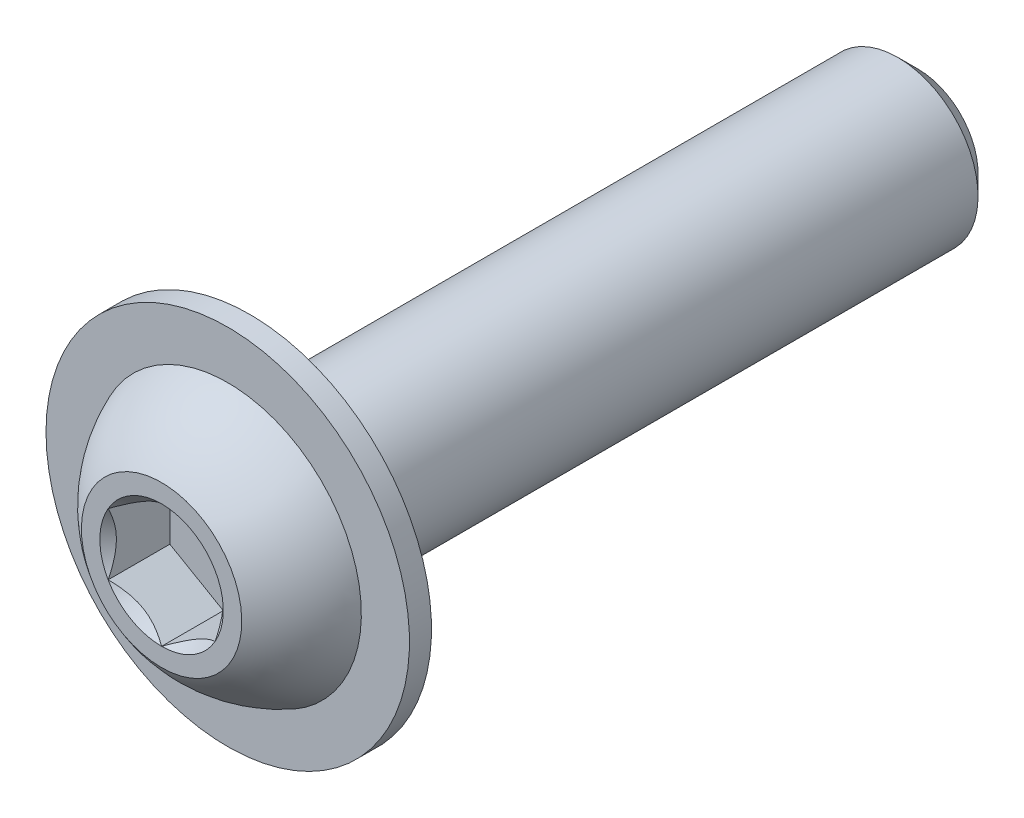
ISO-10303-21;
HEADER;
FILE_DESCRIPTION(('STEP AP214'),'2;1');
FILE_NAME('part.step','',(''),(''),'','','');
FILE_SCHEMA(('AUTOMOTIVE_DESIGN { 1 0 10303 214 1 1 1 1 }'));
ENDSEC;
DATA;
#1=APPLICATION_CONTEXT('core data for automotive mechanical design processes');
#2=APPLICATION_PROTOCOL_DEFINITION('international standard','automotive_design',2000,#1);
#3=PRODUCT_CONTEXT('',#1,'mechanical');
#4=PRODUCT('Part','Part','',(#3));
#5=PRODUCT_RELATED_PRODUCT_CATEGORY('part','',(#4));
#6=PRODUCT_DEFINITION_FORMATION('','',#4);
#7=PRODUCT_DEFINITION_CONTEXT('part definition',#1,'design');
#8=PRODUCT_DEFINITION('design','',#6,#7);
#9=PRODUCT_DEFINITION_SHAPE('','',#8);
#10=(LENGTH_UNIT() NAMED_UNIT(*) SI_UNIT(.MILLI.,.METRE.));
#11=(NAMED_UNIT(*) PLANE_ANGLE_UNIT() SI_UNIT($,.RADIAN.));
#12=(NAMED_UNIT(*) SI_UNIT($,.STERADIAN.) SOLID_ANGLE_UNIT());
#13=UNCERTAINTY_MEASURE_WITH_UNIT(LENGTH_MEASURE(1.E-05),#10,'distance_accuracy_value','');
#14=(GEOMETRIC_REPRESENTATION_CONTEXT(3) GLOBAL_UNCERTAINTY_ASSIGNED_CONTEXT((#13)) GLOBAL_UNIT_ASSIGNED_CONTEXT((#10,
#11,#12)) REPRESENTATION_CONTEXT('',''));
#15=CARTESIAN_POINT('',(0.,0.,0.));
#16=DIRECTION('',(0.,0.,1.));
#17=DIRECTION('',(1.,0.,0.));
#18=AXIS2_PLACEMENT_3D('',#15,#16,#17);
#19=CARTESIAN_POINT('',(0.,-3.,-28.3));
#20=DIRECTION('',(0.,0.,-1.));
#21=DIRECTION('',(0.,1.,0.));
#22=AXIS2_PLACEMENT_3D('',#19,#20,#21);
#23=PLANE('',#22);
#24=CARTESIAN_POINT('',(0.,0.,-28.3));
#25=DIRECTION('',(0.,0.,-1.));
#26=DIRECTION('',(0.,1.,0.));
#27=AXIS2_PLACEMENT_3D('',#24,#25,#26);
#28=CIRCLE('',#27,2.25);
#29=CARTESIAN_POINT('',(0.,2.25,-28.3));
#30=VERTEX_POINT('',#29);
#31=EDGE_CURVE('E203',#30,#30,#28,.T.);
#32=ORIENTED_EDGE('',*,*,#31,.T.);
#33=EDGE_LOOP('',(#32));
#34=FACE_BOUND('',#33,.T.);
#35=ADVANCED_FACE('F41',(#34),#23,.T.);
#36=CARTESIAN_POINT('',(0.,0.,-28.3));
#37=DIRECTION('',(0.,0.,-1.));
#38=DIRECTION('',(0.,1.,0.));
#39=AXIS2_PLACEMENT_3D('',#36,#37,#38);
#40=CYLINDRICAL_SURFACE('',#39,3.);
#41=CARTESIAN_POINT('',(0.,0.,-27.55));
#42=DIRECTION('',(0.,0.,-1.));
#43=DIRECTION('',(0.,1.,0.));
#44=AXIS2_PLACEMENT_3D('',#41,#42,#43);
#45=CIRCLE('',#44,3.);
#46=CARTESIAN_POINT('',(0.,3.,-27.55));
#47=VERTEX_POINT('',#46);
#48=EDGE_CURVE('E56',#47,#47,#45,.F.);
#49=ORIENTED_EDGE('',*,*,#48,.T.);
#50=EDGE_LOOP('',(#49));
#51=FACE_BOUND('',#50,.T.);
#52=CARTESIAN_POINT('',(0.,0.,-3.3));
#53=DIRECTION('',(0.,0.,1.));
#54=DIRECTION('',(1.,0.,0.));
#55=AXIS2_PLACEMENT_3D('',#52,#53,#54);
#56=CIRCLE('',#55,3.);
#57=CARTESIAN_POINT('',(3.,0.,-3.3));
#58=VERTEX_POINT('',#57);
#59=EDGE_CURVE('E199',#58,#58,#56,.F.);
#60=ORIENTED_EDGE('',*,*,#59,.T.);
#61=EDGE_LOOP('',(#60));
#62=FACE_BOUND('',#61,.T.);
#63=ADVANCED_FACE('F210',(#51,#62),#40,.T.);
#64=CARTESIAN_POINT('',(0.,0.,-28.3));
#65=DIRECTION('',(0.,0.,1.));
#66=DIRECTION('',(0.,-1.,0.));
#67=AXIS2_PLACEMENT_3D('',#64,#65,#66);
#68=CONICAL_SURFACE('',#67,2.25,0.785398163397447);
#69=ORIENTED_EDGE('',*,*,#48,.F.);
#70=EDGE_LOOP('',(#69));
#71=FACE_BOUND('',#70,.T.);
#72=ORIENTED_EDGE('',*,*,#31,.F.);
#73=EDGE_LOOP('',(#72));
#74=FACE_BOUND('',#73,.T.);
#75=ADVANCED_FACE('F43',(#71,#74),#68,.T.);
#76=CARTESIAN_POINT('',(0.,-5.,-3.3));
#77=DIRECTION('',(0.,0.,1.));
#78=DIRECTION('',(1.,0.,0.));
#79=AXIS2_PLACEMENT_3D('',#76,#77,#78);
#80=PLANE('',#79);
#81=ORIENTED_EDGE('',*,*,#59,.F.);
#82=EDGE_LOOP('',(#81));
#83=FACE_BOUND('',#82,.T.);
#84=CARTESIAN_POINT('',(0.,0.,-3.3));
#85=DIRECTION('',(0.,0.,-1.));
#86=DIRECTION('',(-1.,0.,0.));
#87=AXIS2_PLACEMENT_3D('',#84,#85,#86);
#88=CIRCLE('',#87,6.8);
#89=CARTESIAN_POINT('',(-6.8,0.,-3.3));
#90=VERTEX_POINT('',#89);
#91=EDGE_CURVE('E188',#90,#90,#88,.T.);
#92=ORIENTED_EDGE('',*,*,#91,.T.);
#93=EDGE_LOOP('',(#92));
#94=FACE_BOUND('',#93,.T.);
#95=ADVANCED_FACE('F215',(#83,#94),#80,.F.);
#96=CARTESIAN_POINT('',(0.,0.,-2.475));
#97=DIRECTION('',(0.,0.,-1.));
#98=DIRECTION('',(-1.,0.,0.));
#99=AXIS2_PLACEMENT_3D('',#96,#97,#98);
#100=PLANE('',#99);
#101=CARTESIAN_POINT('',(0.,0.,-2.475));
#102=DIRECTION('',(0.,0.,-1.));
#103=DIRECTION('',(-1.,0.,0.));
#104=AXIS2_PLACEMENT_3D('',#101,#102,#103);
#105=CIRCLE('',#104,6.8);
#106=CARTESIAN_POINT('',(-6.8,0.,-2.475));
#107=VERTEX_POINT('',#106);
#108=EDGE_CURVE('E183',#107,#107,#105,.T.);
#109=ORIENTED_EDGE('',*,*,#108,.F.);
#110=EDGE_LOOP('',(#109));
#111=FACE_BOUND('',#110,.T.);
#112=CARTESIAN_POINT('',(0.,0.,-2.475));
#113=DIRECTION('',(0.,0.,-1.));
#114=DIRECTION('',(-1.,0.,0.));
#115=AXIS2_PLACEMENT_3D('',#112,#113,#114);
#116=CIRCLE('',#115,5.);
#117=CARTESIAN_POINT('',(0.,-5.,-2.475));
#118=VERTEX_POINT('',#117);
#119=EDGE_CURVE('E187',#118,#118,#116,.T.);
#120=ORIENTED_EDGE('',*,*,#119,.T.);
#121=EDGE_LOOP('',(#120));
#122=FACE_BOUND('',#121,.T.);
#123=ADVANCED_FACE('F233',(#111,#122),#100,.F.);
#124=CARTESIAN_POINT('',(0.,0.,-2.475));
#125=DIRECTION('',(0.,0.,-1.));
#126=DIRECTION('',(-1.,0.,0.));
#127=AXIS2_PLACEMENT_3D('',#124,#125,#126);
#128=CYLINDRICAL_SURFACE('',#127,6.8);
#129=ORIENTED_EDGE('',*,*,#108,.T.);
#130=EDGE_LOOP('',(#129));
#131=FACE_BOUND('',#130,.T.);
#132=ORIENTED_EDGE('',*,*,#91,.F.);
#133=EDGE_LOOP('',(#132));
#134=FACE_BOUND('',#133,.T.);
#135=ADVANCED_FACE('F230',(#131,#134),#128,.T.);
#136=CARTESIAN_POINT('',(0.,-3.,0.));
#137=DIRECTION('',(0.,0.,-1.));
#138=DIRECTION('',(-1.,0.,0.));
#139=AXIS2_PLACEMENT_3D('',#136,#137,#138);
#140=PLANE('',#139);
#141=CARTESIAN_POINT('',(0.,0.,0.));
#142=DIRECTION('',(0.,0.,1.));
#143=DIRECTION('',(1.,0.,0.));
#144=AXIS2_PLACEMENT_3D('',#141,#142,#143);
#145=CIRCLE('',#144,2.3094010767585);
#146=CARTESIAN_POINT('',(-2.,1.15470053837925,0.));
#147=VERTEX_POINT('',#146);
#148=CARTESIAN_POINT('',(-2.,-1.15470053837925,0.));
#149=VERTEX_POINT('',#148);
#150=EDGE_CURVE('E69',#147,#149,#145,.T.);
#151=ORIENTED_EDGE('',*,*,#150,.F.);
#152=CARTESIAN_POINT('',(0.,2.3094010767585,0.));
#153=VERTEX_POINT('',#152);
#154=EDGE_CURVE('E146',#153,#147,#145,.T.);
#155=ORIENTED_EDGE('',*,*,#154,.F.);
#156=CARTESIAN_POINT('',(2.,1.15470053837925,0.));
#157=VERTEX_POINT('',#156);
#158=EDGE_CURVE('E141',#157,#153,#145,.T.);
#159=ORIENTED_EDGE('',*,*,#158,.F.);
#160=CARTESIAN_POINT('',(2.,-1.15470053837925,0.));
#161=VERTEX_POINT('',#160);
#162=EDGE_CURVE('E110',#161,#157,#145,.T.);
#163=ORIENTED_EDGE('',*,*,#162,.F.);
#164=CARTESIAN_POINT('',(0.,-2.3094010767585,0.));
#165=VERTEX_POINT('',#164);
#166=EDGE_CURVE('E101',#165,#161,#145,.T.);
#167=ORIENTED_EDGE('',*,*,#166,.F.);
#168=EDGE_CURVE('E62',#149,#165,#145,.T.);
#169=ORIENTED_EDGE('',*,*,#168,.F.);
#170=EDGE_LOOP('',(#151,#155,#159,#163,#167,#169));
#171=FACE_BOUND('',#170,.T.);
#172=CARTESIAN_POINT('',(0.,0.,0.));
#173=DIRECTION('',(0.,0.,1.));
#174=DIRECTION('',(1.,0.,0.));
#175=AXIS2_PLACEMENT_3D('',#172,#173,#174);
#176=CIRCLE('',#175,3.);
#177=CARTESIAN_POINT('',(0.,-3.,0.));
#178=VERTEX_POINT('',#177);
#179=EDGE_CURVE('E195',#178,#178,#176,.T.);
#180=ORIENTED_EDGE('',*,*,#179,.T.);
#181=EDGE_LOOP('',(#180));
#182=FACE_BOUND('',#181,.T.);
#183=ADVANCED_FACE('F138',(#171,#182),#140,.F.);
#184=CARTESIAN_POINT('',(0.,0.,-4.46982323232323));
#185=DIRECTION('',(0.,0.,1.));
#186=DIRECTION('',(0.,-1.,0.));
#187=AXIS2_PLACEMENT_3D('',#184,#185,#186);
#188=SPHERICAL_SURFACE('',#187,5.38324434966652);
#189=CARTESIAN_POINT('',(0.,-3.,0.));
#190=CARTESIAN_POINT('',(0.,-3.02793971131669,-0.0187521776932429));
#191=CARTESIAN_POINT('',(0.,-3.05570355525953,-0.0377663850890329));
#192=CARTESIAN_POINT('',(0.,-3.11086984588058,-0.0763120297819729));
#193=CARTESIAN_POINT('',(0.,-3.13827229255879,-0.095843467079123));
#194=CARTESIAN_POINT('',(0.,-3.19270612613364,-0.135416742071047));
#195=CARTESIAN_POINT('',(0.,-3.21973751303028,-0.15545857976582));
#196=CARTESIAN_POINT('',(0.,-3.27341972905368,-0.19604559784099));
#197=CARTESIAN_POINT('',(0.,-3.30007055818043,-0.216590778221387));
#198=CARTESIAN_POINT('',(0.,-3.35298228536925,-0.258177260020972));
#199=CARTESIAN_POINT('',(0.,-3.37924318343132,-0.279218561440162));
#200=CARTESIAN_POINT('',(0.,-3.43136581475418,-0.321789885718026));
#201=CARTESIAN_POINT('',(0.,-3.45722754801497,-0.343319908576701));
#202=CARTESIAN_POINT('',(0.,-3.50854275570397,-0.386861105220153));
#203=CARTESIAN_POINT('',(0.,-3.53399623013217,-0.408872279004929));
#204=CARTESIAN_POINT('',(0.,-3.58448596985833,-0.453368037546438));
#205=CARTESIAN_POINT('',(0.,-3.60952223515628,-0.475852622303171));
#206=CARTESIAN_POINT('',(0.,-3.65916875298262,-0.521287296433854));
#207=CARTESIAN_POINT('',(0.,-3.68377900551101,-0.544237385807804));
#208=CARTESIAN_POINT('',(0.,-3.73256484397254,-0.590594999112384));
#209=CARTESIAN_POINT('',(0.,-3.75674042990568,-0.614002523043015));
#210=CARTESIAN_POINT('',(0.,-3.80464843419169,-0.661266774555216));
#211=CARTESIAN_POINT('',(0.,-3.82838085254456,-0.685123502136785));
#212=CARTESIAN_POINT('',(0.,-3.87539417651916,-0.733277772088057));
#213=CARTESIAN_POINT('',(0.,-3.8986750821409,-0.757575314457759));
#214=CARTESIAN_POINT('',(0.,-3.94477719426987,-0.806602670116894));
#215=CARTESIAN_POINT('',(0.,-3.9675984007771,-0.831332483406326));
#216=CARTESIAN_POINT('',(0.,-4.0127730899401,-0.881215685034799));
#217=CARTESIAN_POINT('',(0.,-4.03512657259586,-0.90636907337384));
#218=CARTESIAN_POINT('',(0.,-4.07935795378703,-0.957090580287584));
#219=CARTESIAN_POINT('',(0.,-4.10123585232245,-0.982658698862288));
#220=CARTESIAN_POINT('',(0.,-4.14450837223613,-1.0342006755997));
#221=CARTESIAN_POINT('',(0.,-4.1659029936144,-1.06017453376241));
#222=CARTESIAN_POINT('',(0.,-4.20820143611419,-1.1125188563559));
#223=CARTESIAN_POINT('',(0.,-4.22910525723572,-1.13888932078669));
#224=CARTESIAN_POINT('',(0.,-4.27041474870502,-1.19201758313572));
#225=CARTESIAN_POINT('',(0.,-4.2908204190528,-1.21877538105397));
#226=CARTESIAN_POINT('',(0.,-4.33112643362489,-1.27266890139727));
#227=CARTESIAN_POINT('',(0.,-4.35102677784921,-1.29980462382233));
#228=CARTESIAN_POINT('',(0.,-4.39031514251508,-1.35444445130707));
#229=CARTESIAN_POINT('',(0.,-4.40970316295662,-1.38194855636675));
#230=CARTESIAN_POINT('',(0.,-4.44796006254863,-1.43731547771232));
#231=CARTESIAN_POINT('',(0.,-4.46682894169908,-1.46517829399821));
#232=CARTESIAN_POINT('',(0.,-4.50404092374899,-1.52125284025227));
#233=CARTESIAN_POINT('',(0.,-4.52238402664844,-1.54946457022044));
#234=CARTESIAN_POINT('',(0.,-4.55853800611739,-1.60622702360501));
#235=CARTESIAN_POINT('',(0.,-4.5763488826869,-1.6347777470214));
#236=CARTESIAN_POINT('',(0.,-4.61143214656795,-1.69220814786576));
#237=CARTESIAN_POINT('',(0.,-4.62870453387949,-1.72108782529373));
#238=CARTESIAN_POINT('',(0.,-4.66270474566288,-1.77916597905509));
#239=CARTESIAN_POINT('',(0.,-4.67943257013472,-1.80836445538848));
#240=CARTESIAN_POINT('',(0.,-4.71233777416465,-1.86706993974512));
#241=CARTESIAN_POINT('',(0.,-4.72851515372273,-1.89657694776838));
#242=CARTESIAN_POINT('',(0.,-4.76031377933115,-1.95588911983047));
#243=CARTESIAN_POINT('',(0.,-4.77593502538148,-1.98569428386932));
#244=CARTESIAN_POINT('',(0.,-4.80661589121892,-2.04559228732732));
#245=CARTESIAN_POINT('',(0.,-4.82167551100602,-2.07568512674649));
#246=CARTESIAN_POINT('',(0.,-4.85122782799487,-2.13614789961676));
#247=CARTESIAN_POINT('',(0.,-4.86572052519661,-2.16651783306787));
#248=CARTESIAN_POINT('',(0.,-4.89413390397663,-2.22752411356193));
#249=CARTESIAN_POINT('',(0.,-4.90805458555491,-2.25816046060487));
#250=CARTESIAN_POINT('',(0.,-4.93531902650819,-2.31968880034151));
#251=CARTESIAN_POINT('',(0.,-4.94866278588318,-2.35058079303519));
#252=CARTESIAN_POINT('',(0.,-4.97476873351197,-2.41260954317643));
#253=CARTESIAN_POINT('',(0.,-4.98753092176576,-2.44374630062397));
#254=CARTESIAN_POINT('',(0.,-5.,-2.475));
#255=B_SPLINE_CURVE_WITH_KNOTS('',3,(#189,#190,#191,#192,#193,#194,#195,#196,#197,#198,#199,
#200,#201,#202,#203,#204,#205,#206,#207,#208,#209,#210,#211,#212,#213,#214,#215,#216,#217,#218,
#219,#220,#221,#222,#223,#224,#225,#226,#227,#228,#229,#230,#231,#232,#233,#234,#235,#236,#237,
#238,#239,#240,#241,#242,#243,#244,#245,#246,#247,#248,#249,#250,#251,#252,#253,#254),
.UNSPECIFIED.,.F.,.F.,(4,2,2,2,2,2,2,2,2,2,2,2,2,2,2,2,2,2,2,2,2,2,2,2,2,2,2,2,2,2,2,2,4),(0.,
0.100946251424784,0.201892502849569,0.302838754274352,0.403785005699137,0.50473125712392,
0.605677508548705,0.706623759973489,0.807570011398273,0.908516262823057,1.00946251424784,
1.11040876567263,1.21135501709741,1.31230126852219,1.41324751994698,1.51419377137176,
1.61514002279655,1.71608627422133,1.81703252564611,1.9179787770709,2.01892502849568,
2.11987127992047,2.22081753134525,2.32176378277003,2.42271003419482,2.5236562856196,
2.62460253704439,2.72554878846917,2.82649503989396,2.92744129131874,3.02838754274352,
3.12933379416831,3.23028004559309),.UNSPECIFIED.);
#256=EDGE_CURVE('BSEAM224',#178,#118,#255,.T.);
#257=ORIENTED_EDGE('',*,*,#179,.F.);
#258=ORIENTED_EDGE('',*,*,#119,.F.);
#259=ORIENTED_EDGE('',*,*,#256,.T.);
#260=ORIENTED_EDGE('',*,*,#256,.F.);
#261=EDGE_LOOP('',(#257,#259,#258,#260));
#262=FACE_BOUND('',#261,.T.);
#263=ADVANCED_FACE('F224',(#262),#188,.T.);
#264=CARTESIAN_POINT('',(0.,0.,0.));
#265=DIRECTION('',(0.,0.,1.));
#266=DIRECTION('',(1.,0.,0.));
#267=AXIS2_PLACEMENT_3D('',#264,#265,#266);
#268=CONICAL_SURFACE('',#267,2.3094010767585,0.78539816339745);
#269=ORIENTED_EDGE('',*,*,#162,.T.);
#270=CARTESIAN_POINT('',(2.,-2.30294417292923,0.740771355027721));
#271=CARTESIAN_POINT('',(2.,-2.24687002663712,0.698443273625964));
#272=CARTESIAN_POINT('',(2.,-2.19048190536959,0.656525156864338));
#273=CARTESIAN_POINT('',(2.,-2.07695390496424,0.573690417861017));
#274=CARTESIAN_POINT('',(2.,-2.01981384066454,0.532774049668074));
#275=CARTESIAN_POINT('',(2.,-1.90424016804776,0.451833452018563));
#276=CARTESIAN_POINT('',(2.,-1.8457999674391,0.411818591559868));
#277=CARTESIAN_POINT('',(2.,-1.7279274546176,0.333288993664294));
#278=CARTESIAN_POINT('',(2.,-1.66849521292324,0.294774150243142));
#279=CARTESIAN_POINT('',(2.,-1.4816299571002,0.177640651604295));
#280=CARTESIAN_POINT('',(2.,-1.35220318163536,0.102145901729644));
#281=CARTESIAN_POINT('',(2.,-1.08689521592924,-0.035950649005619));
#282=CARTESIAN_POINT('',(2.,-0.951037763938191,-0.0985959140965044));
#283=CARTESIAN_POINT('',(2.,-0.747111912259408,-0.175236456124857));
#284=CARTESIAN_POINT('',(2.,-0.682064034147875,-0.197232820080877));
#285=CARTESIAN_POINT('',(2.,-0.550398103294751,-0.23600331233986));
#286=CARTESIAN_POINT('',(2.,-0.483779942722474,-0.252777080878817));
#287=CARTESIAN_POINT('',(2.,-0.350484328847653,-0.279951742115555));
#288=CARTESIAN_POINT('',(2.,-0.283829489364785,-0.290461823258314));
#289=CARTESIAN_POINT('',(2.,-0.149806987139376,-0.304903914455084));
#290=CARTESIAN_POINT('',(2.,-0.0824394489341211,-0.308837055266886));
#291=CARTESIAN_POINT('',(2.,0.0499055622944906,-0.309833523066283));
#292=CARTESIAN_POINT('',(2.,0.114881285143173,-0.307140355149591));
#293=CARTESIAN_POINT('',(2.,0.244275921482762,-0.295569929577308));
#294=CARTESIAN_POINT('',(2.,0.308694780266754,-0.286692071166776));
#295=CARTESIAN_POINT('',(2.,0.437599788610706,-0.263086340703852));
#296=CARTESIAN_POINT('',(2.,0.502067428644596,-0.248258916553488));
#297=CARTESIAN_POINT('',(2.,0.629594322598307,-0.21354211637203));
#298=CARTESIAN_POINT('',(2.,0.692653693883151,-0.193653163893724));
#299=CARTESIAN_POINT('',(2.,0.891187889210545,-0.123553020743801));
#300=CARTESIAN_POINT('',(2.,1.02383545707306,-0.065358199678491));
#301=CARTESIAN_POINT('',(2.,1.28290932150074,0.0640305754595763));
#302=CARTESIAN_POINT('',(2.,1.4093111258757,0.135271231414841));
#303=CARTESIAN_POINT('',(2.,1.59200441438963,0.24644199187472));
#304=CARTESIAN_POINT('',(2.,1.65027549026191,0.283182190337375));
#305=CARTESIAN_POINT('',(2.,1.76581760389243,0.358214514183766));
#306=CARTESIAN_POINT('',(2.,1.82308856543105,0.396506757118039));
#307=CARTESIAN_POINT('',(2.,1.93629654762084,0.474042264081225));
#308=CARTESIAN_POINT('',(2.,1.99224062500539,0.513275276133585));
#309=CARTESIAN_POINT('',(2.,2.103364240299,0.592778830736516));
#310=CARTESIAN_POINT('',(2.,2.15854398422468,0.633049085000597));
#311=CARTESIAN_POINT('',(2.,2.21340370692659,0.673744238145942));
#312=B_SPLINE_CURVE_WITH_KNOTS('',3,(#270,#271,#272,#273,#274,#275,#276,#277,#278,#279,#280,
#281,#282,#283,#284,#285,#286,#287,#288,#289,#290,#291,#292,#293,#294,#295,#296,#297,#298,#299,
#300,#301,#302,#303,#304,#305,#306,#307,#308,#309,#310,#311),.UNSPECIFIED.,.F.,.F.,(4,2,2,2,2,2,
2,2,2,2,2,2,2,2,2,2,2,2,2,2,4),(0.,0.210772731976891,0.421598374658589,0.634057554623488,
0.84650169587017,1.29562155455624,1.74319622821645,1.94902062110207,2.15485918928326,
2.35699582502635,2.5590977043214,2.75388435553556,2.94868993014815,3.14690093452586,
3.34509535789702,3.77838155837654,4.21325029921625,4.41989056685647,4.62654651460921,
4.8315237711129,5.03644465914085),.UNSPECIFIED.);
#313=EDGE_CURVE('E11',#161,#157,#312,.T.);
#314=ORIENTED_EDGE('',*,*,#313,.F.);
#315=EDGE_LOOP('',(#269,#314));
#316=FACE_BOUND('',#315,.T.);
#317=ADVANCED_FACE('F114',(#316),#268,.F.);
#318=ORIENTED_EDGE('',*,*,#158,.T.);
#319=CARTESIAN_POINT('',(2.0002,1.15458506832541,0.000115478713659206));
#320=CARTESIAN_POINT('',(1.93144696596929,1.19427965103065,-0.0395469097744083));
#321=CARTESIAN_POINT('',(1.86154425786449,1.23463799837204,-0.0768800177158386));
#322=CARTESIAN_POINT('',(1.71900475544956,1.31693321846145,-0.145236314863858));
#323=CARTESIAN_POINT('',(1.64635440243464,1.35887791933134,-0.17622146626278));
#324=CARTESIAN_POINT('',(1.49985839894603,1.44345742638069,-0.229299783455858));
#325=CARTESIAN_POINT('',(1.4260500647537,1.48607068799507,-0.25152637282339));
#326=CARTESIAN_POINT('',(1.27680836816473,1.57223542169503,-0.28577118332492));
#327=CARTESIAN_POINT('',(1.20137956608185,1.61578426088223,-0.297814970855866));
#328=CARTESIAN_POINT('',(1.07138449932892,1.69083694766536,-0.308681488094429));
#329=CARTESIAN_POINT('',(1.01698621602989,1.72224381117151,-0.31029024639003));
#330=CARTESIAN_POINT('',(0.908278544480305,1.78500621460364,-0.307581122401289));
#331=CARTESIAN_POINT('',(0.853969194078659,1.81636173267754,-0.303261162242027));
#332=CARTESIAN_POINT('',(0.74586327241066,1.87877671565355,-0.288940432590095));
#333=CARTESIAN_POINT('',(0.692067343445206,1.90983580972306,-0.278933307237994));
#334=CARTESIAN_POINT('',(0.585405737694425,1.97141691651548,-0.253787569750341));
#335=CARTESIAN_POINT('',(0.532539989929286,2.00193897021859,-0.23864935095776));
#336=CARTESIAN_POINT('',(0.397120266910154,2.08012358375727,-0.19370549657081));
#337=CARTESIAN_POINT('',(0.31540616515052,2.12730124240478,-0.160511160574184));
#338=CARTESIAN_POINT('',(0.195252962742197,2.19667172615922,-0.104474176828631));
#339=CARTESIAN_POINT('',(0.155657147890822,2.21953238052245,-0.0847852970530607));
#340=CARTESIAN_POINT('',(0.077199041112127,2.26483018959124,-0.0436126816351295));
#341=CARTESIAN_POINT('',(0.038336316406259,2.28726759416161,-0.0221300483487539));
#342=CARTESIAN_POINT('',(-0.000200000000000462,2.30951654681234,0.000115478713658745));
#343=B_SPLINE_CURVE_WITH_KNOTS('',3,(#319,#320,#321,#322,#323,#324,#325,#326,#327,#328,#329,
#330,#331,#332,#333,#334,#335,#336,#337,#338,#339,#340,#341,#342),.UNSPECIFIED.,.F.,.F.,(4,2,2,
2,2,2,2,2,2,2,2,4),(0.,0.266420613771064,0.534393751523389,0.798110374376915,1.06116288956937,
1.24939906803722,1.43770123566248,1.62621426093932,1.81471283831913,2.11415604834145,
2.26347170717791,2.41269626969771),.UNSPECIFIED.);
#344=EDGE_CURVE('E145',#157,#153,#343,.T.);
#345=ORIENTED_EDGE('',*,*,#344,.F.);
#346=EDGE_LOOP('',(#318,#345));
#347=FACE_BOUND('',#346,.T.);
#348=ADVANCED_FACE('F330',(#347),#268,.F.);
#349=ORIENTED_EDGE('',*,*,#154,.T.);
#350=CARTESIAN_POINT('',(0.000199999999999361,2.30951654681234,0.000115478713659074));
#351=CARTESIAN_POINT('',(-0.068553034030706,2.26982196410711,-0.0395469097744086));
#352=CARTESIAN_POINT('',(-0.138455742135512,2.22946361676572,-0.0768800177158388));
#353=CARTESIAN_POINT('',(-0.280995244550437,2.1471683966763,-0.145236314863857));
#354=CARTESIAN_POINT('',(-0.353645597565359,2.10522369580642,-0.17622146626278));
#355=CARTESIAN_POINT('',(-0.500141601053972,2.02064418875706,-0.229299783455858));
#356=CARTESIAN_POINT('',(-0.573949935246295,1.97803092714269,-0.25152637282339));
#357=CARTESIAN_POINT('',(-0.723191631835265,1.89186619344273,-0.28577118332492));
#358=CARTESIAN_POINT('',(-0.798620433918153,1.84831735425552,-0.297814970855866));
#359=CARTESIAN_POINT('',(-0.928615500671081,1.7732646674724,-0.308681488094429));
#360=CARTESIAN_POINT('',(-0.98301378397011,1.74185780396625,-0.31029024639003));
#361=CARTESIAN_POINT('',(-1.09172145551969,1.67909540053412,-0.307581122401289));
#362=CARTESIAN_POINT('',(-1.14603080592134,1.64773988246021,-0.303261162242026));
#363=CARTESIAN_POINT('',(-1.25413672758934,1.5853248994842,-0.288940432590095));
#364=CARTESIAN_POINT('',(-1.30793265655479,1.55426580541469,-0.278933307237994));
#365=CARTESIAN_POINT('',(-1.41459426230558,1.49268469862228,-0.253787569750341));
#366=CARTESIAN_POINT('',(-1.46746001007071,1.46216264491916,-0.238649350957761));
#367=CARTESIAN_POINT('',(-1.60287973308985,1.38397803138048,-0.19370549657081));
#368=CARTESIAN_POINT('',(-1.68459383484948,1.33680037273297,-0.160511160574184));
#369=CARTESIAN_POINT('',(-1.8047470372578,1.26742988897853,-0.10447417682863));
#370=CARTESIAN_POINT('',(-1.84434285210918,1.24456923461531,-0.0847852970530602));
#371=CARTESIAN_POINT('',(-1.92280095888787,1.19927142554652,-0.043612681635129));
#372=CARTESIAN_POINT('',(-1.96166368359374,1.17683402097614,-0.0221300483487535));
#373=CARTESIAN_POINT('',(-2.0002,1.15458506832541,0.000115478713659183));
#374=B_SPLINE_CURVE_WITH_KNOTS('',3,(#350,#351,#352,#353,#354,#355,#356,#357,#358,#359,#360,
#361,#362,#363,#364,#365,#366,#367,#368,#369,#370,#371,#372,#373),.UNSPECIFIED.,.F.,.F.,(4,2,2,
2,2,2,2,2,2,2,2,4),(0.,0.266420613771064,0.534393751523389,0.798110374376915,1.06116288956936,
1.24939906803722,1.43770123566248,1.62621426093932,1.81471283831913,2.11415604834145,
2.26347170717791,2.41269626969771),.UNSPECIFIED.);
#375=EDGE_CURVE('E152',#153,#147,#374,.T.);
#376=ORIENTED_EDGE('',*,*,#375,.F.);
#377=EDGE_LOOP('',(#349,#376));
#378=FACE_BOUND('',#377,.T.);
#379=ADVANCED_FACE('F157',(#378),#268,.F.);
#380=ORIENTED_EDGE('',*,*,#150,.T.);
#381=CARTESIAN_POINT('',(-2.,-2.30294417292923,0.740771355027722));
#382=CARTESIAN_POINT('',(-2.,-2.24687002663712,0.698443273625965));
#383=CARTESIAN_POINT('',(-2.,-2.19048190536959,0.656525156864339));
#384=CARTESIAN_POINT('',(-2.,-2.07695390496424,0.573690417861019));
#385=CARTESIAN_POINT('',(-2.,-2.01981384066454,0.532774049668075));
#386=CARTESIAN_POINT('',(-2.,-1.90424016804776,0.451833452018564));
#387=CARTESIAN_POINT('',(-2.,-1.8457999674391,0.411818591559869));
#388=CARTESIAN_POINT('',(-2.,-1.7279274546176,0.333288993664294));
#389=CARTESIAN_POINT('',(-2.,-1.66849521292324,0.294774150243143));
#390=CARTESIAN_POINT('',(-2.,-1.4816299571002,0.177640651604295));
#391=CARTESIAN_POINT('',(-2.,-1.35220318163536,0.102145901729644));
#392=CARTESIAN_POINT('',(-2.,-1.08689521592925,-0.0359506490056186));
#393=CARTESIAN_POINT('',(-2.,-0.951037763938192,-0.0985959140965041));
#394=CARTESIAN_POINT('',(-2.,-0.747111912259409,-0.175236456124857));
#395=CARTESIAN_POINT('',(-2.,-0.682064034147876,-0.197232820080877));
#396=CARTESIAN_POINT('',(-2.,-0.550398103294752,-0.23600331233986));
#397=CARTESIAN_POINT('',(-2.,-0.483779942722475,-0.252777080878817));
#398=CARTESIAN_POINT('',(-2.,-0.350484328847654,-0.279951742115555));
#399=CARTESIAN_POINT('',(-2.,-0.283829489364785,-0.290461823258314));
#400=CARTESIAN_POINT('',(-2.,-0.149806987139376,-0.304903914455084));
#401=CARTESIAN_POINT('',(-2.,-0.0824394489341216,-0.308837055266886));
#402=CARTESIAN_POINT('',(-2.,0.0499055622944898,-0.309833523066282));
#403=CARTESIAN_POINT('',(-2.,0.114881285143172,-0.307140355149591));
#404=CARTESIAN_POINT('',(-2.,0.244275921482761,-0.295569929577307));
#405=CARTESIAN_POINT('',(-2.,0.308694780266753,-0.286692071166776));
#406=CARTESIAN_POINT('',(-2.,0.437599788610705,-0.263086340703851));
#407=CARTESIAN_POINT('',(-2.,0.502067428644595,-0.248258916553488));
#408=CARTESIAN_POINT('',(-2.,0.629594322598306,-0.21354211637203));
#409=CARTESIAN_POINT('',(-2.,0.69265369388315,-0.193653163893724));
#410=CARTESIAN_POINT('',(-2.,0.891187889210544,-0.123553020743801));
#411=CARTESIAN_POINT('',(-2.,1.02383545707306,-0.0653581996784918));
#412=CARTESIAN_POINT('',(-2.,1.28290932150074,0.0640305754595755));
#413=CARTESIAN_POINT('',(-2.,1.4093111258757,0.13527123141484));
#414=CARTESIAN_POINT('',(-2.,1.59200441438963,0.246441991874719));
#415=CARTESIAN_POINT('',(-2.,1.65027549026191,0.283182190337373));
#416=CARTESIAN_POINT('',(-2.,1.76581760389242,0.358214514183764));
#417=CARTESIAN_POINT('',(-2.,1.82308856543104,0.396506757118038));
#418=CARTESIAN_POINT('',(-2.,1.93629654762084,0.474042264081224));
#419=CARTESIAN_POINT('',(-2.,1.99224062500538,0.513275276133583));
#420=CARTESIAN_POINT('',(-2.,2.10336424029899,0.592778830736514));
#421=CARTESIAN_POINT('',(-2.,2.15854398422468,0.633049085000595));
#422=CARTESIAN_POINT('',(-2.,2.21340370692658,0.67374423814594));
#423=B_SPLINE_CURVE_WITH_KNOTS('',3,(#381,#382,#383,#384,#385,#386,#387,#388,#389,#390,#391,
#392,#393,#394,#395,#396,#397,#398,#399,#400,#401,#402,#403,#404,#405,#406,#407,#408,#409,#410,
#411,#412,#413,#414,#415,#416,#417,#418,#419,#420,#421,#422),.UNSPECIFIED.,.F.,.F.,(4,2,2,2,2,2,
2,2,2,2,2,2,2,2,2,2,2,2,2,2,4),(0.,0.210772731976891,0.421598374658589,0.634057554623488,
0.846501695870171,1.29562155455624,1.74319622821645,1.94902062110207,2.15485918928326,
2.35699582502635,2.5590977043214,2.75388435553556,2.94868993014815,3.14690093452586,
3.34509535789702,3.77838155837654,4.21325029921625,4.41989056685647,4.62654651460921,
4.83152377111289,5.03644465914085),.UNSPECIFIED.);
#424=EDGE_CURVE('E162',#147,#149,#423,.F.);
#425=ORIENTED_EDGE('',*,*,#424,.F.);
#426=EDGE_LOOP('',(#380,#425));
#427=FACE_BOUND('',#426,.T.);
#428=ADVANCED_FACE('F324',(#427),#268,.F.);
#429=ORIENTED_EDGE('',*,*,#168,.T.);
#430=CARTESIAN_POINT('',(-2.0002,-1.15458506832541,0.000115478713659206));
#431=CARTESIAN_POINT('',(-1.93144696596929,-1.19427965103065,-0.039546909774408));
#432=CARTESIAN_POINT('',(-1.86154425786449,-1.23463799837204,-0.0768800177158382));
#433=CARTESIAN_POINT('',(-1.71900475544956,-1.31693321846145,-0.145236314863857));
#434=CARTESIAN_POINT('',(-1.64635440243464,-1.35887791933134,-0.17622146626278));
#435=CARTESIAN_POINT('',(-1.49985839894603,-1.44345742638069,-0.229299783455858));
#436=CARTESIAN_POINT('',(-1.42605006475371,-1.48607068799507,-0.251526372823389));
#437=CARTESIAN_POINT('',(-1.27680836816474,-1.57223542169503,-0.285771183324919));
#438=CARTESIAN_POINT('',(-1.20137956608185,-1.61578426088223,-0.297814970855866));
#439=CARTESIAN_POINT('',(-1.07138449932892,-1.69083694766536,-0.308681488094428));
#440=CARTESIAN_POINT('',(-1.01698621602989,-1.72224381117151,-0.31029024639003));
#441=CARTESIAN_POINT('',(-0.908278544480306,-1.78500621460364,-0.307581122401289));
#442=CARTESIAN_POINT('',(-0.853969194078661,-1.81636173267754,-0.303261162242026));
#443=CARTESIAN_POINT('',(-0.745863272410662,-1.87877671565355,-0.288940432590094));
#444=CARTESIAN_POINT('',(-0.692067343445208,-1.90983580972306,-0.278933307237994));
#445=CARTESIAN_POINT('',(-0.585405737694426,-1.97141691651548,-0.253787569750341));
#446=CARTESIAN_POINT('',(-0.532539989929287,-2.00193897021859,-0.23864935095776));
#447=CARTESIAN_POINT('',(-0.397120266910155,-2.08012358375727,-0.193705496570809));
#448=CARTESIAN_POINT('',(-0.315406165150521,-2.12730124240478,-0.160511160574184));
#449=CARTESIAN_POINT('',(-0.195252962742197,-2.19667172615922,-0.10447417682863));
#450=CARTESIAN_POINT('',(-0.155657147890823,-2.21953238052245,-0.0847852970530597));
#451=CARTESIAN_POINT('',(-0.0771990411121275,-2.26483018959124,-0.0436126816351284));
#452=CARTESIAN_POINT('',(-0.0383363164062595,-2.28726759416161,-0.0221300483487529));
#453=CARTESIAN_POINT('',(0.000200000000000201,-2.30951654681234,0.000115478713659659));
#454=B_SPLINE_CURVE_WITH_KNOTS('',3,(#430,#431,#432,#433,#434,#435,#436,#437,#438,#439,#440,
#441,#442,#443,#444,#445,#446,#447,#448,#449,#450,#451,#452,#453),.UNSPECIFIED.,.F.,.F.,(4,2,2,
2,2,2,2,2,2,2,2,4),(0.,0.266420613771064,0.534393751523388,0.798110374376914,1.06116288956936,
1.24939906803722,1.43770123566247,1.62621426093932,1.81471283831913,2.11415604834145,
2.2634717071779,2.41269626969771),.UNSPECIFIED.);
#455=EDGE_CURVE('E127',#149,#165,#454,.T.);
#456=ORIENTED_EDGE('',*,*,#455,.F.);
#457=EDGE_LOOP('',(#429,#456));
#458=FACE_BOUND('',#457,.T.);
#459=ADVANCED_FACE('F263',(#458),#268,.F.);
#460=ORIENTED_EDGE('',*,*,#166,.T.);
#461=CARTESIAN_POINT('',(-0.000199999999999658,-2.30951654681234,0.000115478713659942));
#462=CARTESIAN_POINT('',(0.0685530340307059,-2.26982196410711,-0.0395469097744077));
#463=CARTESIAN_POINT('',(0.138455742135512,-2.22946361676572,-0.076880017715838));
#464=CARTESIAN_POINT('',(0.280995244550437,-2.1471683966763,-0.145236314863857));
#465=CARTESIAN_POINT('',(0.353645597565359,-2.10522369580642,-0.176221466262779));
#466=CARTESIAN_POINT('',(0.500141601053972,-2.02064418875706,-0.229299783455858));
#467=CARTESIAN_POINT('',(0.573949935246295,-1.97803092714269,-0.251526372823389));
#468=CARTESIAN_POINT('',(0.723191631835265,-1.89186619344273,-0.28577118332492));
#469=CARTESIAN_POINT('',(0.798620433918153,-1.84831735425552,-0.297814970855866));
#470=CARTESIAN_POINT('',(0.92861550067108,-1.7732646674724,-0.308681488094428));
#471=CARTESIAN_POINT('',(0.98301378397011,-1.74185780396625,-0.31029024639003));
#472=CARTESIAN_POINT('',(1.09172145551969,-1.67909540053412,-0.307581122401289));
#473=CARTESIAN_POINT('',(1.14603080592134,-1.64773988246021,-0.303261162242026));
#474=CARTESIAN_POINT('',(1.25413672758934,-1.5853248994842,-0.288940432590094));
#475=CARTESIAN_POINT('',(1.30793265655479,-1.55426580541469,-0.278933307237994));
#476=CARTESIAN_POINT('',(1.41459426230557,-1.49268469862228,-0.253787569750341));
#477=CARTESIAN_POINT('',(1.46746001007071,-1.46216264491917,-0.23864935095776));
#478=CARTESIAN_POINT('',(1.60287973308985,-1.38397803138049,-0.19370549657081));
#479=CARTESIAN_POINT('',(1.68459383484948,-1.33680037273297,-0.160511160574184));
#480=CARTESIAN_POINT('',(1.8047470372578,-1.26742988897853,-0.104474176828631));
#481=CARTESIAN_POINT('',(1.84434285210918,-1.24456923461531,-0.0847852970530606));
#482=CARTESIAN_POINT('',(1.92280095888787,-1.19927142554652,-0.0436126816351292));
#483=CARTESIAN_POINT('',(1.96166368359374,-1.17683402097614,-0.0221300483487536));
#484=CARTESIAN_POINT('',(2.0002,-1.15458506832541,0.000115478713658796));
#485=B_SPLINE_CURVE_WITH_KNOTS('',3,(#461,#462,#463,#464,#465,#466,#467,#468,#469,#470,#471,
#472,#473,#474,#475,#476,#477,#478,#479,#480,#481,#482,#483,#484),.UNSPECIFIED.,.F.,.F.,(4,2,2,
2,2,2,2,2,2,2,2,4),(0.,0.266420613771064,0.534393751523389,0.798110374376915,1.06116288956937,
1.24939906803722,1.43770123566248,1.62621426093932,1.81471283831913,2.11415604834145,
2.26347170717791,2.41269626969771),.UNSPECIFIED.);
#486=EDGE_CURVE('E105',#165,#161,#485,.T.);
#487=ORIENTED_EDGE('',*,*,#486,.F.);
#488=EDGE_LOOP('',(#460,#487));
#489=FACE_BOUND('',#488,.T.);
#490=ADVANCED_FACE('F103',(#489),#268,.F.);
#491=CARTESIAN_POINT('',(2.,-1.15470053837925,-2.31));
#492=DIRECTION('',(0.,0.,1.));
#493=DIRECTION('',(1.,0.,0.));
#494=AXIS2_PLACEMENT_3D('',#491,#492,#493);
#495=PLANE('',#494);
#496=DIRECTION('',(0.866025403784438,0.500000000000001,0.));
#497=VECTOR('',#496,1.);
#498=CARTESIAN_POINT('',(0.,-2.3094010767585,-2.31));
#499=LINE('',#498,#497);
#500=CARTESIAN_POINT('',(0.,-2.3094010767585,-2.31));
#501=VERTEX_POINT('',#500);
#502=CARTESIAN_POINT('',(2.,-1.15470053837925,-2.31));
#503=VERTEX_POINT('',#502);
#504=EDGE_CURVE('E126',#501,#503,#499,.T.);
#505=ORIENTED_EDGE('',*,*,#504,.T.);
#506=DIRECTION('',(0.,1.,0.));
#507=VECTOR('',#506,1.);
#508=CARTESIAN_POINT('',(2.,-1.15470053837925,-2.31));
#509=LINE('',#508,#507);
#510=CARTESIAN_POINT('',(2.,1.15470053837925,-2.31));
#511=VERTEX_POINT('',#510);
#512=EDGE_CURVE('E131',#503,#511,#509,.T.);
#513=ORIENTED_EDGE('',*,*,#512,.T.);
#514=DIRECTION('',(-0.866025403784439,0.5,0.));
#515=VECTOR('',#514,1.);
#516=CARTESIAN_POINT('',(2.,1.15470053837925,-2.31));
#517=LINE('',#516,#515);
#518=CARTESIAN_POINT('',(0.,2.3094010767585,-2.31));
#519=VERTEX_POINT('',#518);
#520=EDGE_CURVE('E308',#511,#519,#517,.T.);
#521=ORIENTED_EDGE('',*,*,#520,.T.);
#522=DIRECTION('',(-0.866025403784438,-0.5,0.));
#523=VECTOR('',#522,1.);
#524=CARTESIAN_POINT('',(0.,2.3094010767585,-2.31));
#525=LINE('',#524,#523);
#526=CARTESIAN_POINT('',(-2.,1.15470053837925,-2.31));
#527=VERTEX_POINT('',#526);
#528=EDGE_CURVE('E171',#519,#527,#525,.T.);
#529=ORIENTED_EDGE('',*,*,#528,.T.);
#530=DIRECTION('',(0.,-1.,0.));
#531=VECTOR('',#530,1.);
#532=CARTESIAN_POINT('',(-2.,1.15470053837925,-2.31));
#533=LINE('',#532,#531);
#534=CARTESIAN_POINT('',(-2.,-1.15470053837925,-2.31));
#535=VERTEX_POINT('',#534);
#536=EDGE_CURVE('E314',#527,#535,#533,.T.);
#537=ORIENTED_EDGE('',*,*,#536,.T.);
#538=DIRECTION('',(0.866025403784439,-0.5,0.));
#539=VECTOR('',#538,1.);
#540=CARTESIAN_POINT('',(-2.,-1.15470053837925,-2.31));
#541=LINE('',#540,#539);
#542=EDGE_CURVE('E135',#535,#501,#541,.T.);
#543=ORIENTED_EDGE('',*,*,#542,.T.);
#544=EDGE_LOOP('',(#505,#513,#521,#529,#537,#543));
#545=FACE_BOUND('',#544,.T.);
#546=ADVANCED_FACE('F262',(#545),#495,.T.);
#547=CARTESIAN_POINT('',(2.,-1.15470053837925,-2.31));
#548=DIRECTION('',(1.,0.,0.));
#549=DIRECTION('',(0.,0.,-1.));
#550=AXIS2_PLACEMENT_3D('',#547,#548,#549);
#551=PLANE('',#550);
#552=DIRECTION('',(0.,0.,1.));
#553=VECTOR('',#552,1.);
#554=CARTESIAN_POINT('',(2.,-1.15470053837925,-2.31));
#555=LINE('',#554,#553);
#556=EDGE_CURVE('E122',#503,#161,#555,.T.);
#557=ORIENTED_EDGE('',*,*,#556,.T.);
#558=ORIENTED_EDGE('',*,*,#313,.T.);
#559=DIRECTION('',(0.,0.,1.));
#560=VECTOR('',#559,1.);
#561=CARTESIAN_POINT('',(2.,1.15470053837925,-2.31));
#562=LINE('',#561,#560);
#563=EDGE_CURVE('E134',#511,#157,#562,.T.);
#564=ORIENTED_EDGE('',*,*,#563,.F.);
#565=ORIENTED_EDGE('',*,*,#512,.F.);
#566=EDGE_LOOP('',(#557,#558,#564,#565));
#567=FACE_BOUND('',#566,.T.);
#568=ADVANCED_FACE('F129',(#567),#551,.F.);
#569=CARTESIAN_POINT('',(2.,1.15470053837925,-2.31));
#570=DIRECTION('',(0.5,0.866025403784439,0.));
#571=DIRECTION('',(-0.866025403784439,0.5,0.));
#572=AXIS2_PLACEMENT_3D('',#569,#570,#571);
#573=PLANE('',#572);
#574=ORIENTED_EDGE('',*,*,#563,.T.);
#575=ORIENTED_EDGE('',*,*,#344,.T.);
#576=DIRECTION('',(0.,0.,1.));
#577=VECTOR('',#576,1.);
#578=CARTESIAN_POINT('',(0.,2.3094010767585,-2.31));
#579=LINE('',#578,#577);
#580=EDGE_CURVE('E167',#519,#153,#579,.T.);
#581=ORIENTED_EDGE('',*,*,#580,.F.);
#582=ORIENTED_EDGE('',*,*,#520,.F.);
#583=EDGE_LOOP('',(#574,#575,#581,#582));
#584=FACE_BOUND('',#583,.T.);
#585=ADVANCED_FACE('F165',(#584),#573,.F.);
#586=CARTESIAN_POINT('',(0.,2.3094010767585,-2.31));
#587=DIRECTION('',(-0.5,0.866025403784438,0.));
#588=DIRECTION('',(-0.866025403784439,-0.5,0.));
#589=AXIS2_PLACEMENT_3D('',#586,#587,#588);
#590=PLANE('',#589);
#591=ORIENTED_EDGE('',*,*,#580,.T.);
#592=ORIENTED_EDGE('',*,*,#375,.T.);
#593=DIRECTION('',(0.,0.,1.));
#594=VECTOR('',#593,1.);
#595=CARTESIAN_POINT('',(-2.,1.15470053837925,-2.31));
#596=LINE('',#595,#594);
#597=EDGE_CURVE('E174',#527,#147,#596,.T.);
#598=ORIENTED_EDGE('',*,*,#597,.F.);
#599=ORIENTED_EDGE('',*,*,#528,.F.);
#600=EDGE_LOOP('',(#591,#592,#598,#599));
#601=FACE_BOUND('',#600,.T.);
#602=ADVANCED_FACE('F169',(#601),#590,.F.);
#603=CARTESIAN_POINT('',(-2.,1.15470053837925,-2.31));
#604=DIRECTION('',(-1.,0.,0.));
#605=DIRECTION('',(0.,-1.,0.));
#606=AXIS2_PLACEMENT_3D('',#603,#604,#605);
#607=PLANE('',#606);
#608=ORIENTED_EDGE('',*,*,#597,.T.);
#609=ORIENTED_EDGE('',*,*,#424,.T.);
#610=DIRECTION('',(0.,0.,1.));
#611=VECTOR('',#610,1.);
#612=CARTESIAN_POINT('',(-2.,-1.15470053837925,-2.31));
#613=LINE('',#612,#611);
#614=EDGE_CURVE('E178',#535,#149,#613,.T.);
#615=ORIENTED_EDGE('',*,*,#614,.F.);
#616=ORIENTED_EDGE('',*,*,#536,.F.);
#617=EDGE_LOOP('',(#608,#609,#615,#616));
#618=FACE_BOUND('',#617,.T.);
#619=ADVANCED_FACE('F285',(#618),#607,.F.);
#620=CARTESIAN_POINT('',(-2.,-1.15470053837925,-2.31));
#621=DIRECTION('',(-0.5,-0.866025403784439,0.));
#622=DIRECTION('',(0.866025403784439,-0.5,0.));
#623=AXIS2_PLACEMENT_3D('',#620,#621,#622);
#624=PLANE('',#623);
#625=ORIENTED_EDGE('',*,*,#614,.T.);
#626=ORIENTED_EDGE('',*,*,#455,.T.);
#627=DIRECTION('',(0.,0.,1.));
#628=VECTOR('',#627,1.);
#629=CARTESIAN_POINT('',(0.,-2.3094010767585,-2.31));
#630=LINE('',#629,#628);
#631=EDGE_CURVE('E124',#501,#165,#630,.T.);
#632=ORIENTED_EDGE('',*,*,#631,.F.);
#633=ORIENTED_EDGE('',*,*,#542,.F.);
#634=EDGE_LOOP('',(#625,#626,#632,#633));
#635=FACE_BOUND('',#634,.T.);
#636=ADVANCED_FACE('F243',(#635),#624,.F.);
#637=CARTESIAN_POINT('',(0.,-2.3094010767585,-2.31));
#638=DIRECTION('',(0.500000000000001,-0.866025403784438,0.));
#639=DIRECTION('',(0.866025403784438,0.500000000000001,0.));
#640=AXIS2_PLACEMENT_3D('',#637,#638,#639);
#641=PLANE('',#640);
#642=ORIENTED_EDGE('',*,*,#631,.T.);
#643=ORIENTED_EDGE('',*,*,#486,.T.);
#644=ORIENTED_EDGE('',*,*,#556,.F.);
#645=ORIENTED_EDGE('',*,*,#504,.F.);
#646=EDGE_LOOP('',(#642,#643,#644,#645));
#647=FACE_BOUND('',#646,.T.);
#648=ADVANCED_FACE('F120',(#647),#641,.F.);
#649=CLOSED_SHELL('',(#35,#63,#75,#95,#123,#135,#183,#263,#317,#348,#379,#428,#459,#490,#546,
#568,#585,#602,#619,#636,#648));
#650=MANIFOLD_SOLID_BREP('B2',#649);
#651=ADVANCED_BREP_SHAPE_REPRESENTATION('',(#18,#650),#14);
#652=SHAPE_DEFINITION_REPRESENTATION(#9,#651);
ENDSEC;
END-ISO-10303-21;
